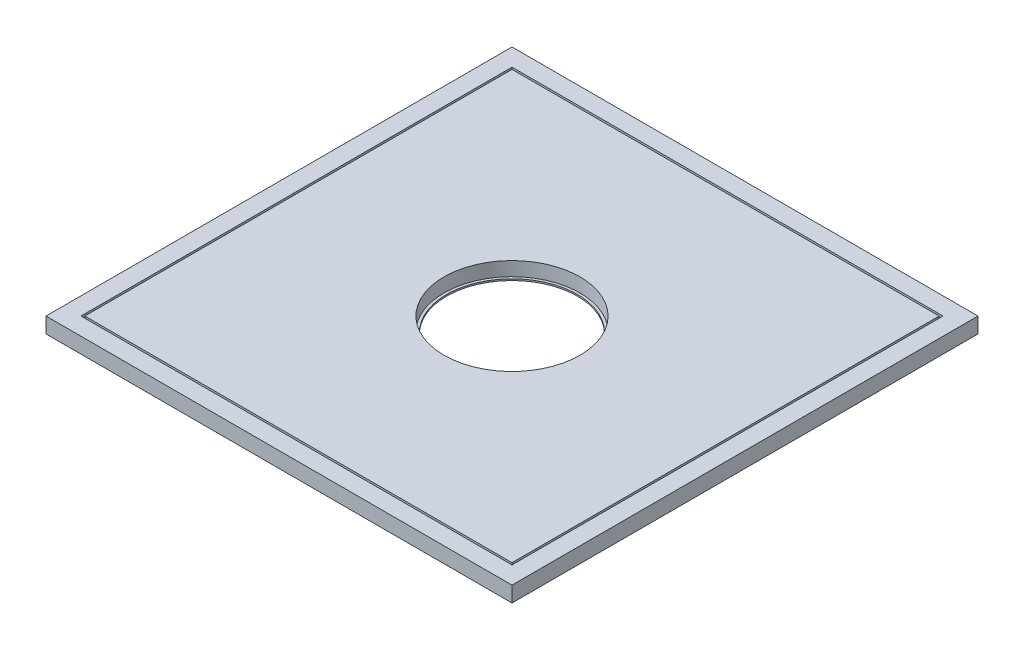
ISO-10303-21;
HEADER;
FILE_DESCRIPTION(('STEP AP214'),'2;1');
FILE_NAME('part.step','',(''),(''),'','','');
FILE_SCHEMA(('AUTOMOTIVE_DESIGN { 1 0 10303 214 1 1 1 1 }'));
ENDSEC;
DATA;
#1=APPLICATION_CONTEXT('core data for automotive mechanical design processes');
#2=APPLICATION_PROTOCOL_DEFINITION('international standard','automotive_design',2000,#1);
#3=PRODUCT_CONTEXT('',#1,'mechanical');
#4=PRODUCT('Part','Part','',(#3));
#5=PRODUCT_RELATED_PRODUCT_CATEGORY('part','',(#4));
#6=PRODUCT_DEFINITION_FORMATION('','',#4);
#7=PRODUCT_DEFINITION_CONTEXT('part definition',#1,'design');
#8=PRODUCT_DEFINITION('design','',#6,#7);
#9=PRODUCT_DEFINITION_SHAPE('','',#8);
#10=(LENGTH_UNIT() NAMED_UNIT(*) SI_UNIT(.MILLI.,.METRE.));
#11=(NAMED_UNIT(*) PLANE_ANGLE_UNIT() SI_UNIT($,.RADIAN.));
#12=(NAMED_UNIT(*) SI_UNIT($,.STERADIAN.) SOLID_ANGLE_UNIT());
#13=UNCERTAINTY_MEASURE_WITH_UNIT(LENGTH_MEASURE(1.E-05),#10,'distance_accuracy_value','');
#14=(GEOMETRIC_REPRESENTATION_CONTEXT(3) GLOBAL_UNCERTAINTY_ASSIGNED_CONTEXT((#13)) GLOBAL_UNIT_ASSIGNED_CONTEXT((#10,
#11,#12)) REPRESENTATION_CONTEXT('',''));
#15=CARTESIAN_POINT('',(0.,0.,0.));
#16=DIRECTION('',(0.,0.,1.));
#17=DIRECTION('',(1.,0.,0.));
#18=AXIS2_PLACEMENT_3D('',#15,#16,#17);
#19=CARTESIAN_POINT('',(0.,20.,0.));
#20=DIRECTION('',(0.,1.,0.));
#21=DIRECTION('',(0.,0.,1.));
#22=AXIS2_PLACEMENT_3D('',#19,#20,#21);
#23=PLANE('',#22);
#24=CARTESIAN_POINT('',(0.,20.,0.));
#25=DIRECTION('',(0.,1.,0.));
#26=DIRECTION('',(0.,0.,1.));
#27=AXIS2_PLACEMENT_3D('',#24,#25,#26);
#28=CIRCLE('',#27,87.5);
#29=CARTESIAN_POINT('',(0.,20.,87.5));
#30=VERTEX_POINT('',#29);
#31=EDGE_CURVE('E239',#30,#30,#28,.T.);
#32=ORIENTED_EDGE('',*,*,#31,.F.);
#33=EDGE_LOOP('',(#32));
#34=FACE_BOUND('',#33,.T.);
#35=DIRECTION('',(1.,0.,0.));
#36=VECTOR('',#35,1.);
#37=CARTESIAN_POINT('',(-275.,20.,275.));
#38=LINE('',#37,#36);
#39=CARTESIAN_POINT('',(-275.,20.,275.));
#40=VERTEX_POINT('',#39);
#41=CARTESIAN_POINT('',(275.,20.,275.));
#42=VERTEX_POINT('',#41);
#43=EDGE_CURVE('E164',#40,#42,#38,.T.);
#44=ORIENTED_EDGE('',*,*,#43,.T.);
#45=DIRECTION('',(0.,0.,-1.));
#46=VECTOR('',#45,1.);
#47=CARTESIAN_POINT('',(275.,20.,-275.));
#48=LINE('',#47,#46);
#49=CARTESIAN_POINT('',(275.,20.,-275.));
#50=VERTEX_POINT('',#49);
#51=EDGE_CURVE('E174',#42,#50,#48,.T.);
#52=ORIENTED_EDGE('',*,*,#51,.T.);
#53=DIRECTION('',(-1.,0.,0.));
#54=VECTOR('',#53,1.);
#55=CARTESIAN_POINT('',(-275.,20.,-275.));
#56=LINE('',#55,#54);
#57=CARTESIAN_POINT('',(-275.,20.,-275.));
#58=VERTEX_POINT('',#57);
#59=EDGE_CURVE('E141',#50,#58,#56,.T.);
#60=ORIENTED_EDGE('',*,*,#59,.T.);
#61=DIRECTION('',(0.,0.,1.));
#62=VECTOR('',#61,1.);
#63=CARTESIAN_POINT('',(-275.,20.,-275.));
#64=LINE('',#63,#62);
#65=EDGE_CURVE('E69',#58,#40,#64,.T.);
#66=ORIENTED_EDGE('',*,*,#65,.T.);
#67=EDGE_LOOP('',(#44,#52,#60,#66));
#68=FACE_BOUND('',#67,.T.);
#69=ADVANCED_FACE('F44',(#34,#68),#23,.T.);
#70=CARTESIAN_POINT('',(300.,20.,-300.));
#71=DIRECTION('',(-1.,0.,0.));
#72=DIRECTION('',(0.,0.,1.));
#73=AXIS2_PLACEMENT_3D('',#70,#71,#72);
#74=PLANE('',#73);
#75=DIRECTION('',(0.,0.,-1.));
#76=VECTOR('',#75,1.);
#77=CARTESIAN_POINT('',(300.,0.,-300.));
#78=LINE('',#77,#76);
#79=CARTESIAN_POINT('',(300.,0.,300.));
#80=VERTEX_POINT('',#79);
#81=CARTESIAN_POINT('',(300.,0.,-300.));
#82=VERTEX_POINT('',#81);
#83=EDGE_CURVE('E238',#80,#82,#78,.T.);
#84=ORIENTED_EDGE('',*,*,#83,.T.);
#85=DIRECTION('',(0.,-1.,0.));
#86=VECTOR('',#85,1.);
#87=CARTESIAN_POINT('',(300.,20.,-300.));
#88=LINE('',#87,#86);
#89=CARTESIAN_POINT('',(300.,20.,-300.));
#90=VERTEX_POINT('',#89);
#91=EDGE_CURVE('E11',#90,#82,#88,.T.);
#92=ORIENTED_EDGE('',*,*,#91,.F.);
#93=DIRECTION('',(0.,0.,-1.));
#94=VECTOR('',#93,1.);
#95=CARTESIAN_POINT('',(300.,20.,-300.));
#96=LINE('',#95,#94);
#97=CARTESIAN_POINT('',(300.,20.,300.));
#98=VERTEX_POINT('',#97);
#99=EDGE_CURVE('E243',#98,#90,#96,.T.);
#100=ORIENTED_EDGE('',*,*,#99,.F.);
#101=DIRECTION('',(0.,-1.,0.));
#102=VECTOR('',#101,1.);
#103=CARTESIAN_POINT('',(300.,20.,300.));
#104=LINE('',#103,#102);
#105=EDGE_CURVE('E257',#98,#80,#104,.T.);
#106=ORIENTED_EDGE('',*,*,#105,.T.);
#107=EDGE_LOOP('',(#84,#92,#100,#106));
#108=FACE_BOUND('',#107,.T.);
#109=ADVANCED_FACE('F46',(#108),#74,.F.);
#110=CARTESIAN_POINT('',(-300.,20.,-300.));
#111=DIRECTION('',(0.,0.,1.));
#112=DIRECTION('',(1.,0.,0.));
#113=AXIS2_PLACEMENT_3D('',#110,#111,#112);
#114=PLANE('',#113);
#115=DIRECTION('',(-1.,0.,0.));
#116=VECTOR('',#115,1.);
#117=CARTESIAN_POINT('',(-300.,0.,-300.));
#118=LINE('',#117,#116);
#119=CARTESIAN_POINT('',(-300.,0.,-300.));
#120=VERTEX_POINT('',#119);
#121=EDGE_CURVE('E261',#82,#120,#118,.T.);
#122=ORIENTED_EDGE('',*,*,#121,.T.);
#123=DIRECTION('',(0.,-1.,0.));
#124=VECTOR('',#123,1.);
#125=CARTESIAN_POINT('',(-300.,20.,-300.));
#126=LINE('',#125,#124);
#127=CARTESIAN_POINT('',(-300.,20.,-300.));
#128=VERTEX_POINT('',#127);
#129=EDGE_CURVE('E54',#128,#120,#126,.T.);
#130=ORIENTED_EDGE('',*,*,#129,.F.);
#131=DIRECTION('',(-1.,0.,0.));
#132=VECTOR('',#131,1.);
#133=CARTESIAN_POINT('',(-300.,20.,-300.));
#134=LINE('',#133,#132);
#135=EDGE_CURVE('E247',#90,#128,#134,.T.);
#136=ORIENTED_EDGE('',*,*,#135,.F.);
#137=ORIENTED_EDGE('',*,*,#91,.T.);
#138=EDGE_LOOP('',(#122,#130,#136,#137));
#139=FACE_BOUND('',#138,.T.);
#140=ADVANCED_FACE('F298',(#139),#114,.F.);
#141=CARTESIAN_POINT('',(-300.,20.,-300.));
#142=DIRECTION('',(1.,0.,0.));
#143=DIRECTION('',(0.,0.,-1.));
#144=AXIS2_PLACEMENT_3D('',#141,#142,#143);
#145=PLANE('',#144);
#146=DIRECTION('',(0.,0.,1.));
#147=VECTOR('',#146,1.);
#148=CARTESIAN_POINT('',(-300.,0.,-300.));
#149=LINE('',#148,#147);
#150=CARTESIAN_POINT('',(-300.,0.,300.));
#151=VERTEX_POINT('',#150);
#152=EDGE_CURVE('E264',#120,#151,#149,.T.);
#153=ORIENTED_EDGE('',*,*,#152,.T.);
#154=DIRECTION('',(0.,-1.,0.));
#155=VECTOR('',#154,1.);
#156=CARTESIAN_POINT('',(-300.,20.,300.));
#157=LINE('',#156,#155);
#158=CARTESIAN_POINT('',(-300.,20.,300.));
#159=VERTEX_POINT('',#158);
#160=EDGE_CURVE('E272',#159,#151,#157,.T.);
#161=ORIENTED_EDGE('',*,*,#160,.F.);
#162=DIRECTION('',(0.,0.,1.));
#163=VECTOR('',#162,1.);
#164=CARTESIAN_POINT('',(-300.,20.,-300.));
#165=LINE('',#164,#163);
#166=EDGE_CURVE('E251',#128,#159,#165,.T.);
#167=ORIENTED_EDGE('',*,*,#166,.F.);
#168=ORIENTED_EDGE('',*,*,#129,.T.);
#169=EDGE_LOOP('',(#153,#161,#167,#168));
#170=FACE_BOUND('',#169,.T.);
#171=ADVANCED_FACE('F282',(#170),#145,.F.);
#172=CARTESIAN_POINT('',(-300.,20.,300.));
#173=DIRECTION('',(0.,0.,-1.));
#174=DIRECTION('',(-1.,0.,0.));
#175=AXIS2_PLACEMENT_3D('',#172,#173,#174);
#176=PLANE('',#175);
#177=DIRECTION('',(1.,0.,0.));
#178=VECTOR('',#177,1.);
#179=CARTESIAN_POINT('',(-300.,0.,300.));
#180=LINE('',#179,#178);
#181=EDGE_CURVE('E248',#151,#80,#180,.T.);
#182=ORIENTED_EDGE('',*,*,#181,.T.);
#183=ORIENTED_EDGE('',*,*,#105,.F.);
#184=DIRECTION('',(1.,0.,0.));
#185=VECTOR('',#184,1.);
#186=CARTESIAN_POINT('',(-300.,20.,300.));
#187=LINE('',#186,#185);
#188=EDGE_CURVE('E254',#159,#98,#187,.T.);
#189=ORIENTED_EDGE('',*,*,#188,.F.);
#190=ORIENTED_EDGE('',*,*,#160,.T.);
#191=EDGE_LOOP('',(#182,#183,#189,#190));
#192=FACE_BOUND('',#191,.T.);
#193=ADVANCED_FACE('F291',(#192),#176,.F.);
#194=DIRECTION('',(0.,0.,-1.));
#195=VECTOR('',#194,1.);
#196=CARTESIAN_POINT('',(277.5,20.,-277.5));
#197=LINE('',#196,#195);
#198=CARTESIAN_POINT('',(277.5,20.,277.5));
#199=VERTEX_POINT('',#198);
#200=CARTESIAN_POINT('',(277.5,20.,-277.5));
#201=VERTEX_POINT('',#200);
#202=EDGE_CURVE('E61',#199,#201,#197,.T.);
#203=ORIENTED_EDGE('',*,*,#202,.F.);
#204=DIRECTION('',(1.,0.,0.));
#205=VECTOR('',#204,1.);
#206=CARTESIAN_POINT('',(-277.5,20.,277.5));
#207=LINE('',#206,#205);
#208=CARTESIAN_POINT('',(-277.5,20.,277.5));
#209=VERTEX_POINT('',#208);
#210=EDGE_CURVE('E193',#209,#199,#207,.T.);
#211=ORIENTED_EDGE('',*,*,#210,.F.);
#212=DIRECTION('',(0.,0.,1.));
#213=VECTOR('',#212,1.);
#214=CARTESIAN_POINT('',(-277.5,20.,-277.5));
#215=LINE('',#214,#213);
#216=CARTESIAN_POINT('',(-277.5,20.,-277.5));
#217=VERTEX_POINT('',#216);
#218=EDGE_CURVE('E212',#217,#209,#215,.T.);
#219=ORIENTED_EDGE('',*,*,#218,.F.);
#220=DIRECTION('',(-1.,0.,0.));
#221=VECTOR('',#220,1.);
#222=CARTESIAN_POINT('',(-277.5,20.,-277.5));
#223=LINE('',#222,#221);
#224=EDGE_CURVE('E208',#201,#217,#223,.T.);
#225=ORIENTED_EDGE('',*,*,#224,.F.);
#226=EDGE_LOOP('',(#203,#211,#219,#225));
#227=FACE_BOUND('',#226,.T.);
#228=ORIENTED_EDGE('',*,*,#99,.T.);
#229=ORIENTED_EDGE('',*,*,#135,.T.);
#230=ORIENTED_EDGE('',*,*,#166,.T.);
#231=ORIENTED_EDGE('',*,*,#188,.T.);
#232=EDGE_LOOP('',(#228,#229,#230,#231));
#233=FACE_BOUND('',#232,.T.);
#234=ADVANCED_FACE('F297',(#227,#233),#23,.T.);
#235=CARTESIAN_POINT('',(0.,0.,0.));
#236=DIRECTION('',(0.,1.,0.));
#237=DIRECTION('',(0.,0.,1.));
#238=AXIS2_PLACEMENT_3D('',#235,#236,#237);
#239=PLANE('',#238);
#240=CARTESIAN_POINT('',(0.,0.,0.));
#241=DIRECTION('',(0.,1.,0.));
#242=DIRECTION('',(0.,0.,1.));
#243=AXIS2_PLACEMENT_3D('',#240,#241,#242);
#244=CIRCLE('',#243,84.25);
#245=CARTESIAN_POINT('',(0.,0.,84.25));
#246=VERTEX_POINT('',#245);
#247=EDGE_CURVE('E48',#246,#246,#244,.T.);
#248=ORIENTED_EDGE('',*,*,#247,.T.);
#249=EDGE_LOOP('',(#248));
#250=FACE_BOUND('',#249,.T.);
#251=ORIENTED_EDGE('',*,*,#83,.F.);
#252=ORIENTED_EDGE('',*,*,#181,.F.);
#253=ORIENTED_EDGE('',*,*,#152,.F.);
#254=ORIENTED_EDGE('',*,*,#121,.F.);
#255=EDGE_LOOP('',(#251,#252,#253,#254));
#256=FACE_BOUND('',#255,.T.);
#257=ADVANCED_FACE('F288',(#250,#256),#239,.F.);
#258=CARTESIAN_POINT('',(0.,2.,0.));
#259=DIRECTION('',(0.,1.,0.));
#260=DIRECTION('',(0.,0.,1.));
#261=AXIS2_PLACEMENT_3D('',#258,#259,#260);
#262=CYLINDRICAL_SURFACE('',#261,87.5);
#263=CARTESIAN_POINT('',(0.,2.,0.));
#264=DIRECTION('',(0.,1.,0.));
#265=DIRECTION('',(0.,0.,1.));
#266=AXIS2_PLACEMENT_3D('',#263,#264,#265);
#267=CIRCLE('',#266,87.5);
#268=CARTESIAN_POINT('',(0.,2.,87.5));
#269=VERTEX_POINT('',#268);
#270=EDGE_CURVE('E234',#269,#269,#267,.T.);
#271=ORIENTED_EDGE('',*,*,#270,.F.);
#272=EDGE_LOOP('',(#271));
#273=FACE_BOUND('',#272,.T.);
#274=ORIENTED_EDGE('',*,*,#31,.T.);
#275=EDGE_LOOP('',(#274));
#276=FACE_BOUND('',#275,.T.);
#277=ADVANCED_FACE('F321',(#273,#276),#262,.F.);
#278=CARTESIAN_POINT('',(0.,2.,0.));
#279=DIRECTION('',(0.,1.,0.));
#280=DIRECTION('',(0.,0.,1.));
#281=AXIS2_PLACEMENT_3D('',#278,#279,#280);
#282=PLANE('',#281);
#283=CARTESIAN_POINT('',(0.,2.,0.));
#284=DIRECTION('',(0.,1.,0.));
#285=DIRECTION('',(0.,0.,1.));
#286=AXIS2_PLACEMENT_3D('',#283,#284,#285);
#287=CIRCLE('',#286,84.25);
#288=CARTESIAN_POINT('',(0.,2.,84.25));
#289=VERTEX_POINT('',#288);
#290=EDGE_CURVE('E222',#289,#289,#287,.T.);
#291=ORIENTED_EDGE('',*,*,#290,.F.);
#292=EDGE_LOOP('',(#291));
#293=FACE_BOUND('',#292,.T.);
#294=ORIENTED_EDGE('',*,*,#270,.T.);
#295=EDGE_LOOP('',(#294));
#296=FACE_BOUND('',#295,.T.);
#297=ADVANCED_FACE('F352',(#293,#296),#282,.T.);
#298=CARTESIAN_POINT('',(0.,-16.,0.));
#299=DIRECTION('',(0.,1.,0.));
#300=DIRECTION('',(0.,0.,1.));
#301=AXIS2_PLACEMENT_3D('',#298,#299,#300);
#302=CYLINDRICAL_SURFACE('',#301,84.25);
#303=ORIENTED_EDGE('',*,*,#290,.T.);
#304=EDGE_LOOP('',(#303));
#305=FACE_BOUND('',#304,.T.);
#306=ORIENTED_EDGE('',*,*,#247,.F.);
#307=EDGE_LOOP('',(#306));
#308=FACE_BOUND('',#307,.T.);
#309=ADVANCED_FACE('F350',(#305,#308),#302,.F.);
#310=CARTESIAN_POINT('',(277.5,10.,-277.5));
#311=DIRECTION('',(1.,0.,0.));
#312=DIRECTION('',(0.,0.,-1.));
#313=AXIS2_PLACEMENT_3D('',#310,#311,#312);
#314=PLANE('',#313);
#315=ORIENTED_EDGE('',*,*,#202,.T.);
#316=DIRECTION('',(0.,1.,0.));
#317=VECTOR('',#316,1.);
#318=CARTESIAN_POINT('',(277.5,10.,-277.5));
#319=LINE('',#318,#317);
#320=CARTESIAN_POINT('',(277.5,10.,-277.5));
#321=VERTEX_POINT('',#320);
#322=EDGE_CURVE('E205',#321,#201,#319,.T.);
#323=ORIENTED_EDGE('',*,*,#322,.F.);
#324=DIRECTION('',(0.,0.,-1.));
#325=VECTOR('',#324,1.);
#326=CARTESIAN_POINT('',(277.5,10.,-277.5));
#327=LINE('',#326,#325);
#328=CARTESIAN_POINT('',(277.5,10.,277.5));
#329=VERTEX_POINT('',#328);
#330=EDGE_CURVE('E188',#329,#321,#327,.T.);
#331=ORIENTED_EDGE('',*,*,#330,.F.);
#332=DIRECTION('',(0.,1.,0.));
#333=VECTOR('',#332,1.);
#334=CARTESIAN_POINT('',(277.5,10.,277.5));
#335=LINE('',#334,#333);
#336=EDGE_CURVE('E219',#329,#199,#335,.T.);
#337=ORIENTED_EDGE('',*,*,#336,.T.);
#338=EDGE_LOOP('',(#315,#323,#331,#337));
#339=FACE_BOUND('',#338,.T.);
#340=ADVANCED_FACE('F333',(#339),#314,.F.);
#341=CARTESIAN_POINT('',(-277.5,10.,277.5));
#342=DIRECTION('',(0.,0.,1.));
#343=DIRECTION('',(1.,0.,0.));
#344=AXIS2_PLACEMENT_3D('',#341,#342,#343);
#345=PLANE('',#344);
#346=ORIENTED_EDGE('',*,*,#210,.T.);
#347=ORIENTED_EDGE('',*,*,#336,.F.);
#348=DIRECTION('',(1.,0.,0.));
#349=VECTOR('',#348,1.);
#350=CARTESIAN_POINT('',(-277.5,10.,277.5));
#351=LINE('',#350,#349);
#352=CARTESIAN_POINT('',(-277.5,10.,277.5));
#353=VERTEX_POINT('',#352);
#354=EDGE_CURVE('E201',#353,#329,#351,.T.);
#355=ORIENTED_EDGE('',*,*,#354,.F.);
#356=DIRECTION('',(0.,1.,0.));
#357=VECTOR('',#356,1.);
#358=CARTESIAN_POINT('',(-277.5,10.,277.5));
#359=LINE('',#358,#357);
#360=EDGE_CURVE('E223',#353,#209,#359,.T.);
#361=ORIENTED_EDGE('',*,*,#360,.T.);
#362=EDGE_LOOP('',(#346,#347,#355,#361));
#363=FACE_BOUND('',#362,.T.);
#364=ADVANCED_FACE('F336',(#363),#345,.F.);
#365=CARTESIAN_POINT('',(-277.5,10.,-277.5));
#366=DIRECTION('',(-1.,0.,0.));
#367=DIRECTION('',(0.,0.,1.));
#368=AXIS2_PLACEMENT_3D('',#365,#366,#367);
#369=PLANE('',#368);
#370=ORIENTED_EDGE('',*,*,#218,.T.);
#371=ORIENTED_EDGE('',*,*,#360,.F.);
#372=DIRECTION('',(0.,0.,1.));
#373=VECTOR('',#372,1.);
#374=CARTESIAN_POINT('',(-277.5,10.,-277.5));
#375=LINE('',#374,#373);
#376=CARTESIAN_POINT('',(-277.5,10.,-277.5));
#377=VERTEX_POINT('',#376);
#378=EDGE_CURVE('E197',#377,#353,#375,.T.);
#379=ORIENTED_EDGE('',*,*,#378,.F.);
#380=DIRECTION('',(0.,1.,0.));
#381=VECTOR('',#380,1.);
#382=CARTESIAN_POINT('',(-277.5,10.,-277.5));
#383=LINE('',#382,#381);
#384=EDGE_CURVE('E226',#377,#217,#383,.T.);
#385=ORIENTED_EDGE('',*,*,#384,.T.);
#386=EDGE_LOOP('',(#370,#371,#379,#385));
#387=FACE_BOUND('',#386,.T.);
#388=ADVANCED_FACE('F338',(#387),#369,.F.);
#389=CARTESIAN_POINT('',(-277.5,10.,-277.5));
#390=DIRECTION('',(0.,0.,-1.));
#391=DIRECTION('',(-1.,0.,0.));
#392=AXIS2_PLACEMENT_3D('',#389,#390,#391);
#393=PLANE('',#392);
#394=ORIENTED_EDGE('',*,*,#224,.T.);
#395=ORIENTED_EDGE('',*,*,#384,.F.);
#396=DIRECTION('',(-1.,0.,0.));
#397=VECTOR('',#396,1.);
#398=CARTESIAN_POINT('',(-277.5,10.,-277.5));
#399=LINE('',#398,#397);
#400=EDGE_CURVE('E192',#321,#377,#399,.T.);
#401=ORIENTED_EDGE('',*,*,#400,.F.);
#402=ORIENTED_EDGE('',*,*,#322,.T.);
#403=EDGE_LOOP('',(#394,#395,#401,#402));
#404=FACE_BOUND('',#403,.T.);
#405=ADVANCED_FACE('F329',(#404),#393,.F.);
#406=CARTESIAN_POINT('',(0.,10.,0.));
#407=DIRECTION('',(0.,1.,0.));
#408=DIRECTION('',(0.,0.,1.));
#409=AXIS2_PLACEMENT_3D('',#406,#407,#408);
#410=PLANE('',#409);
#411=DIRECTION('',(1.,0.,0.));
#412=VECTOR('',#411,1.);
#413=CARTESIAN_POINT('',(-275.,10.,275.));
#414=LINE('',#413,#412);
#415=CARTESIAN_POINT('',(-275.,10.,275.));
#416=VERTEX_POINT('',#415);
#417=CARTESIAN_POINT('',(275.,10.,275.));
#418=VERTEX_POINT('',#417);
#419=EDGE_CURVE('E148',#416,#418,#414,.T.);
#420=ORIENTED_EDGE('',*,*,#419,.F.);
#421=DIRECTION('',(0.,0.,1.));
#422=VECTOR('',#421,1.);
#423=CARTESIAN_POINT('',(-275.,10.,-275.));
#424=LINE('',#423,#422);
#425=CARTESIAN_POINT('',(-275.,10.,-275.));
#426=VERTEX_POINT('',#425);
#427=EDGE_CURVE('E158',#426,#416,#424,.T.);
#428=ORIENTED_EDGE('',*,*,#427,.F.);
#429=DIRECTION('',(-1.,0.,0.));
#430=VECTOR('',#429,1.);
#431=CARTESIAN_POINT('',(-275.,10.,-275.));
#432=LINE('',#431,#430);
#433=CARTESIAN_POINT('',(275.,10.,-275.));
#434=VERTEX_POINT('',#433);
#435=EDGE_CURVE('E139',#434,#426,#432,.T.);
#436=ORIENTED_EDGE('',*,*,#435,.F.);
#437=DIRECTION('',(0.,0.,-1.));
#438=VECTOR('',#437,1.);
#439=CARTESIAN_POINT('',(275.,10.,-275.));
#440=LINE('',#439,#438);
#441=EDGE_CURVE('E155',#418,#434,#440,.T.);
#442=ORIENTED_EDGE('',*,*,#441,.F.);
#443=EDGE_LOOP('',(#420,#428,#436,#442));
#444=FACE_BOUND('',#443,.T.);
#445=ORIENTED_EDGE('',*,*,#330,.T.);
#446=ORIENTED_EDGE('',*,*,#400,.T.);
#447=ORIENTED_EDGE('',*,*,#378,.T.);
#448=ORIENTED_EDGE('',*,*,#354,.T.);
#449=EDGE_LOOP('',(#445,#446,#447,#448));
#450=FACE_BOUND('',#449,.T.);
#451=ADVANCED_FACE('F153',(#444,#450),#410,.T.);
#452=CARTESIAN_POINT('',(275.,10.,-275.));
#453=DIRECTION('',(1.,0.,0.));
#454=DIRECTION('',(0.,0.,-1.));
#455=AXIS2_PLACEMENT_3D('',#452,#453,#454);
#456=PLANE('',#455);
#457=ORIENTED_EDGE('',*,*,#51,.F.);
#458=DIRECTION('',(0.,1.,0.));
#459=VECTOR('',#458,1.);
#460=CARTESIAN_POINT('',(275.,10.,275.));
#461=LINE('',#460,#459);
#462=EDGE_CURVE('E162',#418,#42,#461,.T.);
#463=ORIENTED_EDGE('',*,*,#462,.F.);
#464=ORIENTED_EDGE('',*,*,#441,.T.);
#465=DIRECTION('',(0.,1.,0.));
#466=VECTOR('',#465,1.);
#467=CARTESIAN_POINT('',(275.,10.,-275.));
#468=LINE('',#467,#466);
#469=EDGE_CURVE('E136',#434,#50,#468,.T.);
#470=ORIENTED_EDGE('',*,*,#469,.T.);
#471=EDGE_LOOP('',(#457,#463,#464,#470));
#472=FACE_BOUND('',#471,.T.);
#473=ADVANCED_FACE('F161',(#472),#456,.T.);
#474=CARTESIAN_POINT('',(-275.,10.,275.));
#475=DIRECTION('',(0.,0.,1.));
#476=DIRECTION('',(1.,0.,0.));
#477=AXIS2_PLACEMENT_3D('',#474,#475,#476);
#478=PLANE('',#477);
#479=ORIENTED_EDGE('',*,*,#43,.F.);
#480=DIRECTION('',(0.,1.,0.));
#481=VECTOR('',#480,1.);
#482=CARTESIAN_POINT('',(-275.,10.,275.));
#483=LINE('',#482,#481);
#484=EDGE_CURVE('E183',#416,#40,#483,.T.);
#485=ORIENTED_EDGE('',*,*,#484,.F.);
#486=ORIENTED_EDGE('',*,*,#419,.T.);
#487=ORIENTED_EDGE('',*,*,#462,.T.);
#488=EDGE_LOOP('',(#479,#485,#486,#487));
#489=FACE_BOUND('',#488,.T.);
#490=ADVANCED_FACE('F423',(#489),#478,.T.);
#491=CARTESIAN_POINT('',(-275.,10.,-275.));
#492=DIRECTION('',(-1.,0.,0.));
#493=DIRECTION('',(0.,0.,1.));
#494=AXIS2_PLACEMENT_3D('',#491,#492,#493);
#495=PLANE('',#494);
#496=ORIENTED_EDGE('',*,*,#65,.F.);
#497=DIRECTION('',(0.,1.,0.));
#498=VECTOR('',#497,1.);
#499=CARTESIAN_POINT('',(-275.,10.,-275.));
#500=LINE('',#499,#498);
#501=EDGE_CURVE('E147',#426,#58,#500,.T.);
#502=ORIENTED_EDGE('',*,*,#501,.F.);
#503=ORIENTED_EDGE('',*,*,#427,.T.);
#504=ORIENTED_EDGE('',*,*,#484,.T.);
#505=EDGE_LOOP('',(#496,#502,#503,#504));
#506=FACE_BOUND('',#505,.T.);
#507=ADVANCED_FACE('F432',(#506),#495,.T.);
#508=CARTESIAN_POINT('',(-275.,10.,-275.));
#509=DIRECTION('',(0.,0.,-1.));
#510=DIRECTION('',(-1.,0.,0.));
#511=AXIS2_PLACEMENT_3D('',#508,#509,#510);
#512=PLANE('',#511);
#513=ORIENTED_EDGE('',*,*,#59,.F.);
#514=ORIENTED_EDGE('',*,*,#469,.F.);
#515=ORIENTED_EDGE('',*,*,#435,.T.);
#516=ORIENTED_EDGE('',*,*,#501,.T.);
#517=EDGE_LOOP('',(#513,#514,#515,#516));
#518=FACE_BOUND('',#517,.T.);
#519=ADVANCED_FACE('F138',(#518),#512,.T.);
#520=CLOSED_SHELL('',(#69,#109,#140,#171,#193,#234,#257,#277,#297,#309,#340,#364,#388,#405,#451,
#473,#490,#507,#519));
#521=MANIFOLD_SOLID_BREP('B2',#520);
#522=ADVANCED_BREP_SHAPE_REPRESENTATION('',(#18,#521),#14);
#523=SHAPE_DEFINITION_REPRESENTATION(#9,#522);
ENDSEC;
END-ISO-10303-21;
